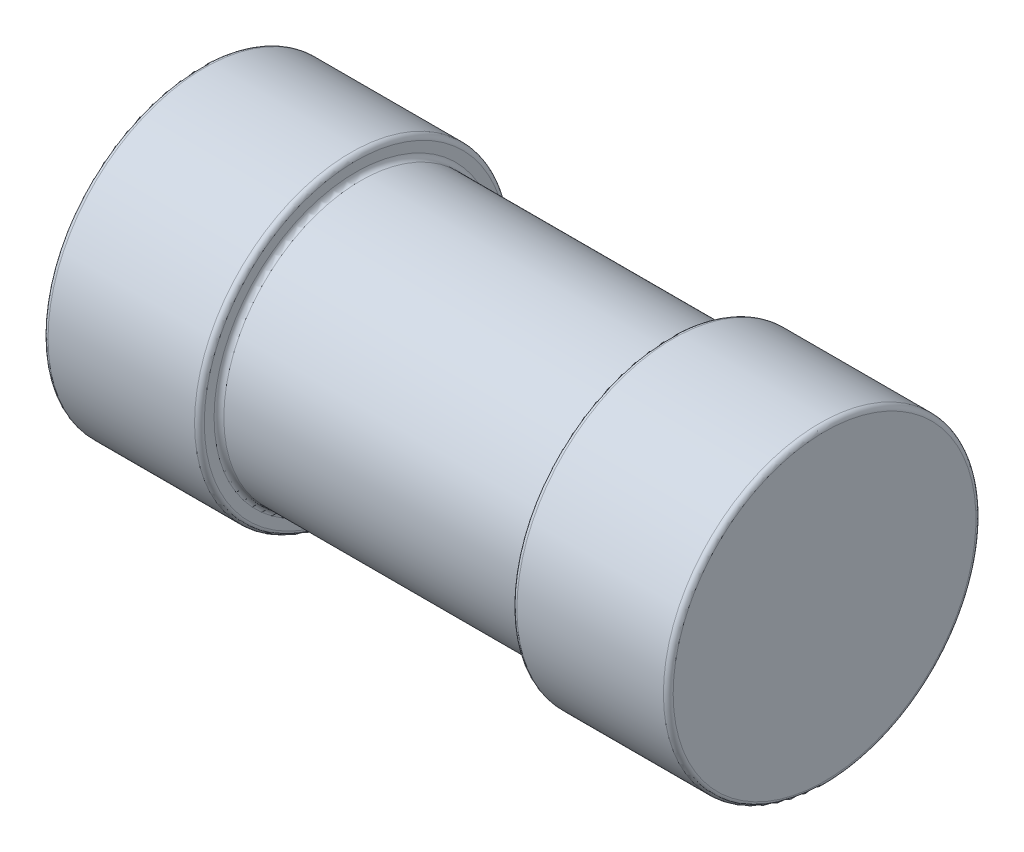
ISO-10303-21;
HEADER;
FILE_DESCRIPTION(('STEP AP214'),'2;1');
FILE_NAME('part.step','',(''),(''),'','','');
FILE_SCHEMA(('AUTOMOTIVE_DESIGN { 1 0 10303 214 1 1 1 1 }'));
ENDSEC;
DATA;
#1=APPLICATION_CONTEXT('core data for automotive mechanical design processes');
#2=APPLICATION_PROTOCOL_DEFINITION('international standard','automotive_design',2000,#1);
#3=PRODUCT_CONTEXT('',#1,'mechanical');
#4=PRODUCT('Part','Part','',(#3));
#5=PRODUCT_RELATED_PRODUCT_CATEGORY('part','',(#4));
#6=PRODUCT_DEFINITION_FORMATION('','',#4);
#7=PRODUCT_DEFINITION_CONTEXT('part definition',#1,'design');
#8=PRODUCT_DEFINITION('design','',#6,#7);
#9=PRODUCT_DEFINITION_SHAPE('','',#8);
#10=(LENGTH_UNIT() NAMED_UNIT(*) SI_UNIT(.MILLI.,.METRE.));
#11=(NAMED_UNIT(*) PLANE_ANGLE_UNIT() SI_UNIT($,.RADIAN.));
#12=(NAMED_UNIT(*) SI_UNIT($,.STERADIAN.) SOLID_ANGLE_UNIT());
#13=UNCERTAINTY_MEASURE_WITH_UNIT(LENGTH_MEASURE(1.E-05),#10,'distance_accuracy_value','');
#14=(GEOMETRIC_REPRESENTATION_CONTEXT(3) GLOBAL_UNCERTAINTY_ASSIGNED_CONTEXT((#13)) GLOBAL_UNIT_ASSIGNED_CONTEXT((#10,
#11,#12)) REPRESENTATION_CONTEXT('',''));
#15=CARTESIAN_POINT('',(0.,0.,0.));
#16=DIRECTION('',(0.,0.,1.));
#17=DIRECTION('',(1.,0.,0.));
#18=AXIS2_PLACEMENT_3D('',#15,#16,#17);
#19=CARTESIAN_POINT('',(0.306686486862979,-4.76853638152283,0.));
#20=DIRECTION('',(-1.,0.,0.));
#21=DIRECTION('',(0.,0.,1.));
#22=AXIS2_PLACEMENT_3D('',#19,#20,#21);
#23=TOROIDAL_SURFACE('',#22,0.724999999999999,0.0249999999999999);
#24=CARTESIAN_POINT('',(0.306686486862979,-4.76853638152283,0.));
#25=DIRECTION('',(-1.,0.,0.));
#26=DIRECTION('',(0.,0.,1.));
#27=AXIS2_PLACEMENT_3D('',#24,#25,#26);
#28=CIRCLE('',#27,0.699999999999999);
#29=CARTESIAN_POINT('',(0.306686486862979,-4.76853638152283,0.699999999999999));
#30=VERTEX_POINT('',#29);
#31=EDGE_CURVE('E75',#30,#30,#28,.T.);
#32=ORIENTED_EDGE('',*,*,#31,.F.);
#33=EDGE_LOOP('',(#32));
#34=FACE_BOUND('',#33,.T.);
#35=CARTESIAN_POINT('',(0.331686486862979,-4.76853638152283,0.));
#36=DIRECTION('',(-1.,0.,0.));
#37=DIRECTION('',(0.,0.,1.));
#38=AXIS2_PLACEMENT_3D('',#35,#36,#37);
#39=CIRCLE('',#38,0.724999999999999);
#40=CARTESIAN_POINT('',(0.331686486862979,-4.76853638152283,0.724999999999999));
#41=VERTEX_POINT('',#40);
#42=EDGE_CURVE('E10',#41,#41,#39,.T.);
#43=ORIENTED_EDGE('',*,*,#42,.T.);
#44=EDGE_LOOP('',(#43));
#45=FACE_BOUND('',#44,.T.);
#46=ADVANCED_FACE('F35',(#34,#45),#23,.F.);
#47=CARTESIAN_POINT('',(0.331686486862979,-3.99353638152283,0.));
#48=DIRECTION('',(1.,0.,0.));
#49=DIRECTION('',(0.,0.,-1.));
#50=AXIS2_PLACEMENT_3D('',#47,#48,#49);
#51=PLANE('',#50);
#52=ORIENTED_EDGE('',*,*,#42,.F.);
#53=EDGE_LOOP('',(#52));
#54=FACE_BOUND('',#53,.T.);
#55=CARTESIAN_POINT('',(0.331686486862979,-4.76853638152283,0.));
#56=DIRECTION('',(-1.,0.,0.));
#57=DIRECTION('',(0.,0.,1.));
#58=AXIS2_PLACEMENT_3D('',#55,#56,#57);
#59=CIRCLE('',#58,0.774999999999998);
#60=CARTESIAN_POINT('',(0.331686486862979,-4.76853638152283,0.774999999999998));
#61=VERTEX_POINT('',#60);
#62=EDGE_CURVE('E41',#61,#61,#59,.T.);
#63=ORIENTED_EDGE('',*,*,#62,.T.);
#64=EDGE_LOOP('',(#63));
#65=FACE_BOUND('',#64,.T.);
#66=ADVANCED_FACE('F82',(#54,#65),#51,.F.);
#67=CARTESIAN_POINT('',(0.356686486862979,-4.76853638152283,0.));
#68=DIRECTION('',(-1.,0.,0.));
#69=DIRECTION('',(0.,0.,1.));
#70=AXIS2_PLACEMENT_3D('',#67,#68,#69);
#71=TOROIDAL_SURFACE('',#70,0.774999999999998,0.0249999999999999);
#72=ORIENTED_EDGE('',*,*,#62,.F.);
#73=EDGE_LOOP('',(#72));
#74=FACE_BOUND('',#73,.T.);
#75=CARTESIAN_POINT('',(0.356686486862979,-4.76853638152283,0.));
#76=DIRECTION('',(-1.,0.,0.));
#77=DIRECTION('',(0.,0.,1.));
#78=AXIS2_PLACEMENT_3D('',#75,#76,#77);
#79=CIRCLE('',#78,0.799999999999998);
#80=CARTESIAN_POINT('',(0.356686486862979,-4.76853638152283,0.799999999999998));
#81=VERTEX_POINT('',#80);
#82=EDGE_CURVE('E45',#81,#81,#79,.T.);
#83=ORIENTED_EDGE('',*,*,#82,.T.);
#84=EDGE_LOOP('',(#83));
#85=FACE_BOUND('',#84,.T.);
#86=ADVANCED_FACE('F86',(#74,#85),#71,.T.);
#87=CARTESIAN_POINT('',(-2.06831351313702,-4.76853638152283,0.));
#88=DIRECTION('',(-1.,0.,0.));
#89=DIRECTION('',(0.,0.,1.));
#90=AXIS2_PLACEMENT_3D('',#87,#88,#89);
#91=CYLINDRICAL_SURFACE('',#90,0.799999999999999);
#92=ORIENTED_EDGE('',*,*,#82,.F.);
#93=EDGE_LOOP('',(#92));
#94=FACE_BOUND('',#93,.T.);
#95=CARTESIAN_POINT('',(1.10668648686298,-4.76853638152283,0.));
#96=DIRECTION('',(-1.,0.,0.));
#97=DIRECTION('',(0.,0.,1.));
#98=AXIS2_PLACEMENT_3D('',#95,#96,#97);
#99=CIRCLE('',#98,0.799999999999999);
#100=CARTESIAN_POINT('',(1.10668648686298,-4.76853638152283,0.799999999999999));
#101=VERTEX_POINT('',#100);
#102=EDGE_CURVE('E49',#101,#101,#99,.T.);
#103=ORIENTED_EDGE('',*,*,#102,.T.);
#104=EDGE_LOOP('',(#103));
#105=FACE_BOUND('',#104,.T.);
#106=ADVANCED_FACE('F91',(#94,#105),#91,.T.);
#107=CARTESIAN_POINT('',(1.10668648686298,-4.76853638152283,0.));
#108=DIRECTION('',(-1.,0.,0.));
#109=DIRECTION('',(0.,0.,1.));
#110=AXIS2_PLACEMENT_3D('',#107,#108,#109);
#111=TOROIDAL_SURFACE('',#110,0.775,0.025);
#112=ORIENTED_EDGE('',*,*,#102,.F.);
#113=EDGE_LOOP('',(#112));
#114=FACE_BOUND('',#113,.T.);
#115=CARTESIAN_POINT('',(1.13168648686298,-4.76853638152283,0.));
#116=DIRECTION('',(-1.,0.,0.));
#117=DIRECTION('',(0.,0.,1.));
#118=AXIS2_PLACEMENT_3D('',#115,#116,#117);
#119=CIRCLE('',#118,0.775);
#120=CARTESIAN_POINT('',(1.13168648686298,-4.76853638152283,0.775));
#121=VERTEX_POINT('',#120);
#122=EDGE_CURVE('E54',#121,#121,#119,.T.);
#123=ORIENTED_EDGE('',*,*,#122,.T.);
#124=EDGE_LOOP('',(#123));
#125=FACE_BOUND('',#124,.T.);
#126=ADVANCED_FACE('F97',(#114,#125),#111,.T.);
#127=CARTESIAN_POINT('',(1.13168648686298,-3.99353638152283,0.));
#128=DIRECTION('',(-1.,0.,0.));
#129=DIRECTION('',(0.,0.,1.));
#130=AXIS2_PLACEMENT_3D('',#127,#128,#129);
#131=PLANE('',#130);
#132=ORIENTED_EDGE('',*,*,#122,.F.);
#133=EDGE_LOOP('',(#132));
#134=FACE_BOUND('',#133,.T.);
#135=ADVANCED_FACE('F101',(#134),#131,.F.);
#136=CARTESIAN_POINT('',(-2.06831351313702,-3.99353638152283,0.));
#137=DIRECTION('',(1.,0.,0.));
#138=DIRECTION('',(0.,0.,-1.));
#139=AXIS2_PLACEMENT_3D('',#136,#137,#138);
#140=PLANE('',#139);
#141=CARTESIAN_POINT('',(-2.06831351313702,-4.76853638152283,0.));
#142=DIRECTION('',(-1.,0.,0.));
#143=DIRECTION('',(0.,0.,1.));
#144=AXIS2_PLACEMENT_3D('',#141,#142,#143);
#145=CIRCLE('',#144,0.775);
#146=CARTESIAN_POINT('',(-2.06831351313702,-4.76853638152283,0.775));
#147=VERTEX_POINT('',#146);
#148=EDGE_CURVE('E57',#147,#147,#145,.T.);
#149=ORIENTED_EDGE('',*,*,#148,.T.);
#150=EDGE_LOOP('',(#149));
#151=FACE_BOUND('',#150,.T.);
#152=ADVANCED_FACE('F105',(#151),#140,.F.);
#153=CARTESIAN_POINT('',(-2.04331351313702,-4.76853638152283,0.));
#154=DIRECTION('',(-1.,0.,0.));
#155=DIRECTION('',(0.,0.,1.));
#156=AXIS2_PLACEMENT_3D('',#153,#154,#155);
#157=TOROIDAL_SURFACE('',#156,0.775,0.0249999999999998);
#158=ORIENTED_EDGE('',*,*,#148,.F.);
#159=EDGE_LOOP('',(#158));
#160=FACE_BOUND('',#159,.T.);
#161=CARTESIAN_POINT('',(-2.04331351313702,-4.76853638152283,0.));
#162=DIRECTION('',(-1.,0.,0.));
#163=DIRECTION('',(0.,0.,1.));
#164=AXIS2_PLACEMENT_3D('',#161,#162,#163);
#165=CIRCLE('',#164,0.799999999999999);
#166=CARTESIAN_POINT('',(-2.04331351313702,-4.76853638152283,0.799999999999999));
#167=VERTEX_POINT('',#166);
#168=EDGE_CURVE('E60',#167,#167,#165,.T.);
#169=ORIENTED_EDGE('',*,*,#168,.T.);
#170=EDGE_LOOP('',(#169));
#171=FACE_BOUND('',#170,.T.);
#172=ADVANCED_FACE('F109',(#160,#171),#157,.T.);
#173=CARTESIAN_POINT('',(-2.06831351313702,-4.76853638152283,0.));
#174=DIRECTION('',(-1.,0.,0.));
#175=DIRECTION('',(0.,0.,1.));
#176=AXIS2_PLACEMENT_3D('',#173,#174,#175);
#177=CYLINDRICAL_SURFACE('',#176,0.799999999999999);
#178=ORIENTED_EDGE('',*,*,#168,.F.);
#179=EDGE_LOOP('',(#178));
#180=FACE_BOUND('',#179,.T.);
#181=CARTESIAN_POINT('',(-1.29331351313702,-4.76853638152283,0.));
#182=DIRECTION('',(-1.,0.,0.));
#183=DIRECTION('',(0.,0.,1.));
#184=AXIS2_PLACEMENT_3D('',#181,#182,#183);
#185=CIRCLE('',#184,0.799999999999999);
#186=CARTESIAN_POINT('',(-1.29331351313702,-4.76853638152283,0.799999999999999));
#187=VERTEX_POINT('',#186);
#188=EDGE_CURVE('E63',#187,#187,#185,.T.);
#189=ORIENTED_EDGE('',*,*,#188,.T.);
#190=EDGE_LOOP('',(#189));
#191=FACE_BOUND('',#190,.T.);
#192=ADVANCED_FACE('F113',(#180,#191),#177,.T.);
#193=CARTESIAN_POINT('',(-1.29331351313702,-4.76853638152283,0.));
#194=DIRECTION('',(-1.,0.,0.));
#195=DIRECTION('',(0.,0.,1.));
#196=AXIS2_PLACEMENT_3D('',#193,#194,#195);
#197=TOROIDAL_SURFACE('',#196,0.775,0.025);
#198=ORIENTED_EDGE('',*,*,#188,.F.);
#199=EDGE_LOOP('',(#198));
#200=FACE_BOUND('',#199,.T.);
#201=CARTESIAN_POINT('',(-1.26831351313702,-4.76853638152283,0.));
#202=DIRECTION('',(-1.,0.,0.));
#203=DIRECTION('',(0.,0.,1.));
#204=AXIS2_PLACEMENT_3D('',#201,#202,#203);
#205=CIRCLE('',#204,0.775);
#206=CARTESIAN_POINT('',(-1.26831351313702,-4.76853638152283,0.775));
#207=VERTEX_POINT('',#206);
#208=EDGE_CURVE('E66',#207,#207,#205,.T.);
#209=ORIENTED_EDGE('',*,*,#208,.T.);
#210=EDGE_LOOP('',(#209));
#211=FACE_BOUND('',#210,.T.);
#212=ADVANCED_FACE('F117',(#200,#211),#197,.T.);
#213=CARTESIAN_POINT('',(-1.26831351313702,-3.99353638152283,0.));
#214=DIRECTION('',(-1.,0.,0.));
#215=DIRECTION('',(0.,0.,1.));
#216=AXIS2_PLACEMENT_3D('',#213,#214,#215);
#217=PLANE('',#216);
#218=ORIENTED_EDGE('',*,*,#208,.F.);
#219=EDGE_LOOP('',(#218));
#220=FACE_BOUND('',#219,.T.);
#221=CARTESIAN_POINT('',(-1.26831351313702,-4.76853638152283,0.));
#222=DIRECTION('',(-1.,0.,0.));
#223=DIRECTION('',(0.,0.,1.));
#224=AXIS2_PLACEMENT_3D('',#221,#222,#223);
#225=CIRCLE('',#224,0.724999999999999);
#226=CARTESIAN_POINT('',(-1.26831351313702,-4.76853638152283,0.724999999999999));
#227=VERTEX_POINT('',#226);
#228=EDGE_CURVE('E69',#227,#227,#225,.T.);
#229=ORIENTED_EDGE('',*,*,#228,.T.);
#230=EDGE_LOOP('',(#229));
#231=FACE_BOUND('',#230,.T.);
#232=ADVANCED_FACE('F121',(#220,#231),#217,.F.);
#233=CARTESIAN_POINT('',(-1.24331351313702,-4.76853638152283,0.));
#234=DIRECTION('',(-1.,0.,0.));
#235=DIRECTION('',(0.,0.,1.));
#236=AXIS2_PLACEMENT_3D('',#233,#234,#235);
#237=TOROIDAL_SURFACE('',#236,0.724999999999999,0.025);
#238=ORIENTED_EDGE('',*,*,#228,.F.);
#239=EDGE_LOOP('',(#238));
#240=FACE_BOUND('',#239,.T.);
#241=CARTESIAN_POINT('',(-1.24331351313702,-4.76853638152283,0.));
#242=DIRECTION('',(-1.,0.,0.));
#243=DIRECTION('',(0.,0.,1.));
#244=AXIS2_PLACEMENT_3D('',#241,#242,#243);
#245=CIRCLE('',#244,0.699999999999999);
#246=CARTESIAN_POINT('',(-1.24331351313702,-4.76853638152283,0.699999999999999));
#247=VERTEX_POINT('',#246);
#248=EDGE_CURVE('E72',#247,#247,#245,.T.);
#249=ORIENTED_EDGE('',*,*,#248,.T.);
#250=EDGE_LOOP('',(#249));
#251=FACE_BOUND('',#250,.T.);
#252=ADVANCED_FACE('F125',(#240,#251),#237,.F.);
#253=CARTESIAN_POINT('',(-2.06831351313702,-4.76853638152283,0.));
#254=DIRECTION('',(-1.,0.,0.));
#255=DIRECTION('',(0.,0.,1.));
#256=AXIS2_PLACEMENT_3D('',#253,#254,#255);
#257=CYLINDRICAL_SURFACE('',#256,0.699999999999999);
#258=ORIENTED_EDGE('',*,*,#248,.F.);
#259=EDGE_LOOP('',(#258));
#260=FACE_BOUND('',#259,.T.);
#261=ORIENTED_EDGE('',*,*,#31,.T.);
#262=EDGE_LOOP('',(#261));
#263=FACE_BOUND('',#262,.T.);
#264=ADVANCED_FACE('F79',(#260,#263),#257,.T.);
#265=CLOSED_SHELL('',(#46,#66,#86,#106,#126,#135,#152,#172,#192,#212,#232,#252,#264));
#266=MANIFOLD_SOLID_BREP('B2',#265);
#267=ADVANCED_BREP_SHAPE_REPRESENTATION('',(#18,#266),#14);
#268=SHAPE_DEFINITION_REPRESENTATION(#9,#267);
ENDSEC;
END-ISO-10303-21;
